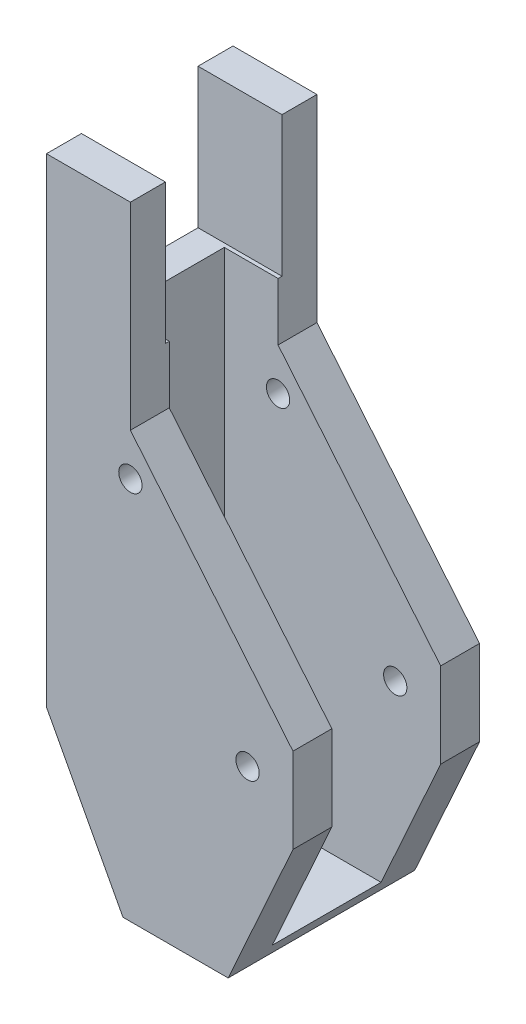
ISO-10303-21;
HEADER;
FILE_DESCRIPTION(('STEP AP214'),'2;1');
FILE_NAME('part.step','',(''),(''),'','','');
FILE_SCHEMA(('AUTOMOTIVE_DESIGN { 1 0 10303 214 1 1 1 1 }'));
ENDSEC;
DATA;
#1=APPLICATION_CONTEXT('core data for automotive mechanical design processes');
#2=APPLICATION_PROTOCOL_DEFINITION('international standard','automotive_design',2000,#1);
#3=PRODUCT_CONTEXT('',#1,'mechanical');
#4=PRODUCT('Part','Part','',(#3));
#5=PRODUCT_RELATED_PRODUCT_CATEGORY('part','',(#4));
#6=PRODUCT_DEFINITION_FORMATION('','',#4);
#7=PRODUCT_DEFINITION_CONTEXT('part definition',#1,'design');
#8=PRODUCT_DEFINITION('design','',#6,#7);
#9=PRODUCT_DEFINITION_SHAPE('','',#8);
#10=(LENGTH_UNIT() NAMED_UNIT(*) SI_UNIT(.MILLI.,.METRE.));
#11=(NAMED_UNIT(*) PLANE_ANGLE_UNIT() SI_UNIT($,.RADIAN.));
#12=(NAMED_UNIT(*) SI_UNIT($,.STERADIAN.) SOLID_ANGLE_UNIT());
#13=UNCERTAINTY_MEASURE_WITH_UNIT(LENGTH_MEASURE(1.E-05),#10,'distance_accuracy_value','');
#14=(GEOMETRIC_REPRESENTATION_CONTEXT(3) GLOBAL_UNCERTAINTY_ASSIGNED_CONTEXT((#13)) GLOBAL_UNIT_ASSIGNED_CONTEXT((#10,
#11,#12)) REPRESENTATION_CONTEXT('',''));
#15=CARTESIAN_POINT('',(0.,0.,0.));
#16=DIRECTION('',(0.,0.,1.));
#17=DIRECTION('',(1.,0.,0.));
#18=AXIS2_PLACEMENT_3D('',#15,#16,#17);
#19=CARTESIAN_POINT('',(0.,0.,19.));
#20=DIRECTION('',(0.,0.,-1.));
#21=DIRECTION('',(-1.,0.,0.));
#22=AXIS2_PLACEMENT_3D('',#19,#20,#21);
#23=PLANE('',#22);
#24=CARTESIAN_POINT('',(6.1762329932904,-28.7166750097972,19.));
#25=DIRECTION('',(0.,0.,1.));
#26=DIRECTION('',(0.,-1.,0.));
#27=AXIS2_PLACEMENT_3D('',#24,#25,#26);
#28=CIRCLE('',#27,1.5);
#29=CARTESIAN_POINT('',(6.1762329932904,-30.2166750097972,19.));
#30=VERTEX_POINT('',#29);
#31=EDGE_CURVE('E372',#30,#30,#28,.T.);
#32=ORIENTED_EDGE('',*,*,#31,.T.);
#33=EDGE_LOOP('',(#32));
#34=FACE_BOUND('',#33,.T.);
#35=CARTESIAN_POINT('',(-8.8962675718864,-4.21667500979055,19.));
#36=DIRECTION('',(0.,0.,1.));
#37=DIRECTION('',(0.,-1.,0.));
#38=AXIS2_PLACEMENT_3D('',#35,#36,#37);
#39=CIRCLE('',#38,1.5);
#40=CARTESIAN_POINT('',(-8.8962675718864,-5.71667500979055,19.));
#41=VERTEX_POINT('',#40);
#42=EDGE_CURVE('E376',#41,#41,#39,.T.);
#43=ORIENTED_EDGE('',*,*,#42,.T.);
#44=EDGE_LOOP('',(#43));
#45=FACE_BOUND('',#44,.T.);
#46=DIRECTION('',(1.,0.,0.));
#47=VECTOR('',#46,1.);
#48=CARTESIAN_POINT('',(-15.8155261006875,-52.0463170033039,19.));
#49=LINE('',#48,#47);
#50=CARTESIAN_POINT('',(-9.86507775354397,-52.0463170033039,19.));
#51=VERTEX_POINT('',#50);
#52=CARTESIAN_POINT('',(4.35754421369536,-52.0463170033039,19.));
#53=VERTEX_POINT('',#52);
#54=EDGE_CURVE('E198',#51,#53,#49,.T.);
#55=ORIENTED_EDGE('',*,*,#54,.F.);
#56=DIRECTION('',(0.8828123820911,0.469725768961675,0.));
#57=VECTOR('',#56,1.);
#58=CARTESIAN_POINT('',(19.4058989978255,-36.4718502856661,19.));
#59=LINE('',#58,#57);
#60=CARTESIAN_POINT('',(-8.71025996628948,-51.4318629198169,19.));
#61=VERTEX_POINT('',#60);
#62=EDGE_CURVE('E204',#51,#61,#59,.T.);
#63=ORIENTED_EDGE('',*,*,#62,.T.);
#64=DIRECTION('',(0.469725768961675,-0.882812382091101,0.));
#65=VECTOR('',#64,1.);
#66=CARTESIAN_POINT('',(-28.116158964115,-14.9600126341507,19.));
#67=LINE('',#66,#65);
#68=CARTESIAN_POINT('',(-12.650870925901,-44.0257967041209,19.));
#69=VERTEX_POINT('',#68);
#70=EDGE_CURVE('E190',#69,#61,#67,.T.);
#71=ORIENTED_EDGE('',*,*,#70,.F.);
#72=CARTESIAN_POINT('',(-16.1821204542654,-45.9046997799675,19.));
#73=DIRECTION('',(0.,0.,-1.));
#74=DIRECTION('',(-1.,0.,0.));
#75=AXIS2_PLACEMENT_3D('',#72,#73,#74);
#76=CIRCLE('',#75,4.);
#77=CARTESIAN_POINT('',(-15.8155261006875,-41.9215341319026,19.));
#78=VERTEX_POINT('',#77);
#79=EDGE_CURVE('E50',#69,#78,#76,.F.);
#80=ORIENTED_EDGE('',*,*,#79,.T.);
#81=DIRECTION('',(0.,1.,0.));
#82=VECTOR('',#81,1.);
#83=CARTESIAN_POINT('',(-15.8155261006875,26.6129669837228,19.));
#84=LINE('',#83,#82);
#85=CARTESIAN_POINT('',(-15.8155261006875,8.61296698372278,19.));
#86=VERTEX_POINT('',#85);
#87=EDGE_CURVE('E355',#78,#86,#84,.T.);
#88=ORIENTED_EDGE('',*,*,#87,.T.);
#89=DIRECTION('',(-1.,0.,0.));
#90=VECTOR('',#89,1.);
#91=CARTESIAN_POINT('',(0.,8.61296698372278,19.));
#92=LINE('',#91,#90);
#93=CARTESIAN_POINT('',(-8.8962675718864,8.61296698372278,19.));
#94=VERTEX_POINT('',#93);
#95=EDGE_CURVE('E280',#94,#86,#92,.T.);
#96=ORIENTED_EDGE('',*,*,#95,.F.);
#97=DIRECTION('',(0.,1.,0.));
#98=VECTOR('',#97,1.);
#99=CARTESIAN_POINT('',(-8.8962675718864,0.,19.));
#100=LINE('',#99,#98);
#101=CARTESIAN_POINT('',(-8.8962675718864,1.19737919058593,19.));
#102=VERTEX_POINT('',#101);
#103=EDGE_CURVE('E324',#102,#94,#100,.T.);
#104=ORIENTED_EDGE('',*,*,#103,.F.);
#105=DIRECTION('',(-0.637310569161828,0.770607058386196,0.));
#106=VECTOR('',#105,1.);
#107=CARTESIAN_POINT('',(-4.69486506864955,-3.88276631582515,19.));
#108=LINE('',#107,#106);
#109=CARTESIAN_POINT('',(12.0229909568544,-24.0972401967161,19.));
#110=VERTEX_POINT('',#109);
#111=EDGE_CURVE('E338',#110,#102,#108,.T.);
#112=ORIENTED_EDGE('',*,*,#111,.F.);
#113=DIRECTION('',(0.,1.,0.));
#114=VECTOR('',#113,1.);
#115=CARTESIAN_POINT('',(12.0229909568544,0.,19.));
#116=LINE('',#115,#114);
#117=CARTESIAN_POINT('',(12.0229909568544,-35.0463170033039,19.));
#118=VERTEX_POINT('',#117);
#119=EDGE_CURVE('E381',#118,#110,#116,.T.);
#120=ORIENTED_EDGE('',*,*,#119,.F.);
#121=DIRECTION('',(-0.411053391132709,-0.911611271122895,0.));
#122=VECTOR('',#121,1.);
#123=CARTESIAN_POINT('',(3.68356302452966,-53.541034871645,19.));
#124=LINE('',#123,#122);
#125=EDGE_CURVE('E229',#118,#53,#124,.T.);
#126=ORIENTED_EDGE('',*,*,#125,.T.);
#127=EDGE_LOOP('',(#55,#63,#71,#80,#88,#96,#104,#112,#120,#126));
#128=FACE_BOUND('',#127,.T.);
#129=ADVANCED_FACE('F41',(#34,#45,#128),#23,.T.);
#130=CARTESIAN_POINT('',(0.,0.,5.));
#131=DIRECTION('',(0.,0.,-1.));
#132=DIRECTION('',(-1.,0.,0.));
#133=AXIS2_PLACEMENT_3D('',#130,#131,#132);
#134=PLANE('',#133);
#135=CARTESIAN_POINT('',(-8.8962675718864,-4.21667500979055,5.));
#136=DIRECTION('',(0.,0.,-1.));
#137=DIRECTION('',(-1.,0.,0.));
#138=AXIS2_PLACEMENT_3D('',#135,#136,#137);
#139=CIRCLE('',#138,1.5);
#140=CARTESIAN_POINT('',(-10.3962675718864,-4.21667500979055,5.));
#141=VERTEX_POINT('',#140);
#142=EDGE_CURVE('E368',#141,#141,#139,.T.);
#143=ORIENTED_EDGE('',*,*,#142,.T.);
#144=EDGE_LOOP('',(#143));
#145=FACE_BOUND('',#144,.T.);
#146=CARTESIAN_POINT('',(6.1762329932904,-28.7166750097972,5.));
#147=DIRECTION('',(0.,0.,-1.));
#148=DIRECTION('',(-1.,0.,0.));
#149=AXIS2_PLACEMENT_3D('',#146,#147,#148);
#150=CIRCLE('',#149,1.5);
#151=CARTESIAN_POINT('',(4.6762329932904,-28.7166750097972,5.));
#152=VERTEX_POINT('',#151);
#153=EDGE_CURVE('E364',#152,#152,#150,.T.);
#154=ORIENTED_EDGE('',*,*,#153,.T.);
#155=EDGE_LOOP('',(#154));
#156=FACE_BOUND('',#155,.T.);
#157=DIRECTION('',(0.8828123820911,0.469725768961675,0.));
#158=VECTOR('',#157,1.);
#159=CARTESIAN_POINT('',(19.4058989978255,-36.4718502856661,5.));
#160=LINE('',#159,#158);
#161=CARTESIAN_POINT('',(-9.86507775354397,-52.0463170033039,5.));
#162=VERTEX_POINT('',#161);
#163=CARTESIAN_POINT('',(-8.71025996628948,-51.4318629198169,5.));
#164=VERTEX_POINT('',#163);
#165=EDGE_CURVE('E207',#162,#164,#160,.T.);
#166=ORIENTED_EDGE('',*,*,#165,.F.);
#167=DIRECTION('',(-1.,0.,0.));
#168=VECTOR('',#167,1.);
#169=CARTESIAN_POINT('',(-15.8155261006875,-52.0463170033039,5.));
#170=LINE('',#169,#168);
#171=CARTESIAN_POINT('',(4.35754421369537,-52.0463170033039,5.));
#172=VERTEX_POINT('',#171);
#173=EDGE_CURVE('E221',#172,#162,#170,.T.);
#174=ORIENTED_EDGE('',*,*,#173,.F.);
#175=DIRECTION('',(0.411053391132709,0.911611271122895,0.));
#176=VECTOR('',#175,1.);
#177=CARTESIAN_POINT('',(3.68356302452966,-53.541034871645,5.));
#178=LINE('',#177,#176);
#179=CARTESIAN_POINT('',(12.0229909568544,-35.0463170033039,5.));
#180=VERTEX_POINT('',#179);
#181=EDGE_CURVE('E232',#172,#180,#178,.T.);
#182=ORIENTED_EDGE('',*,*,#181,.T.);
#183=DIRECTION('',(0.,1.,0.));
#184=VECTOR('',#183,1.);
#185=CARTESIAN_POINT('',(12.0229909568544,0.,5.));
#186=LINE('',#185,#184);
#187=CARTESIAN_POINT('',(12.0229909568544,-24.0972401967161,5.));
#188=VERTEX_POINT('',#187);
#189=EDGE_CURVE('E380',#180,#188,#186,.T.);
#190=ORIENTED_EDGE('',*,*,#189,.T.);
#191=DIRECTION('',(-0.637310569161828,0.770607058386196,0.));
#192=VECTOR('',#191,1.);
#193=CARTESIAN_POINT('',(-4.69486506864955,-3.88276631582515,5.));
#194=LINE('',#193,#192);
#195=CARTESIAN_POINT('',(-8.8962675718864,1.19737919058593,5.));
#196=VERTEX_POINT('',#195);
#197=EDGE_CURVE('E428',#188,#196,#194,.T.);
#198=ORIENTED_EDGE('',*,*,#197,.T.);
#199=DIRECTION('',(0.,1.,0.));
#200=VECTOR('',#199,1.);
#201=CARTESIAN_POINT('',(-8.8962675718864,0.,5.));
#202=LINE('',#201,#200);
#203=CARTESIAN_POINT('',(-8.8962675718864,8.61296698372278,5.));
#204=VERTEX_POINT('',#203);
#205=EDGE_CURVE('E424',#196,#204,#202,.T.);
#206=ORIENTED_EDGE('',*,*,#205,.T.);
#207=DIRECTION('',(-1.,0.,0.));
#208=VECTOR('',#207,1.);
#209=CARTESIAN_POINT('',(0.,8.61296698372278,5.));
#210=LINE('',#209,#208);
#211=CARTESIAN_POINT('',(-15.8155261006875,8.61296698372278,5.));
#212=VERTEX_POINT('',#211);
#213=EDGE_CURVE('E296',#204,#212,#210,.T.);
#214=ORIENTED_EDGE('',*,*,#213,.T.);
#215=DIRECTION('',(0.,-1.,0.));
#216=VECTOR('',#215,1.);
#217=CARTESIAN_POINT('',(-15.8155261006875,26.6129669837228,5.));
#218=LINE('',#217,#216);
#219=CARTESIAN_POINT('',(-15.8155261006875,-41.9215341319026,5.));
#220=VERTEX_POINT('',#219);
#221=EDGE_CURVE('E361',#212,#220,#218,.T.);
#222=ORIENTED_EDGE('',*,*,#221,.T.);
#223=CARTESIAN_POINT('',(-16.1821204542654,-45.9046997799675,5.));
#224=DIRECTION('',(0.,0.,-1.));
#225=DIRECTION('',(-1.,0.,0.));
#226=AXIS2_PLACEMENT_3D('',#223,#224,#225);
#227=CIRCLE('',#226,4.);
#228=CARTESIAN_POINT('',(-12.650870925901,-44.0257967041209,5.));
#229=VERTEX_POINT('',#228);
#230=EDGE_CURVE('E11',#220,#229,#227,.T.);
#231=ORIENTED_EDGE('',*,*,#230,.T.);
#232=DIRECTION('',(0.469725768961675,-0.882812382091101,0.));
#233=VECTOR('',#232,1.);
#234=CARTESIAN_POINT('',(-28.116158964115,-14.9600126341507,5.));
#235=LINE('',#234,#233);
#236=EDGE_CURVE('E447',#229,#164,#235,.T.);
#237=ORIENTED_EDGE('',*,*,#236,.T.);
#238=EDGE_LOOP('',(#166,#174,#182,#190,#198,#206,#214,#222,#231,#237));
#239=FACE_BOUND('',#238,.T.);
#240=ADVANCED_FACE('F464',(#145,#156,#239),#134,.F.);
#241=CARTESIAN_POINT('',(-15.8155261006875,0.,0.));
#242=DIRECTION('',(1.,0.,0.));
#243=DIRECTION('',(0.,0.,-1.));
#244=AXIS2_PLACEMENT_3D('',#241,#242,#243);
#245=PLANE('',#244);
#246=ORIENTED_EDGE('',*,*,#87,.F.);
#247=DIRECTION('',(0.,0.,-1.));
#248=VECTOR('',#247,1.);
#249=CARTESIAN_POINT('',(-15.8155261006875,-41.9215341319026,0.));
#250=LINE('',#249,#248);
#251=EDGE_CURVE('E199',#78,#220,#250,.T.);
#252=ORIENTED_EDGE('',*,*,#251,.T.);
#253=ORIENTED_EDGE('',*,*,#221,.F.);
#254=DIRECTION('',(0.,0.,-1.));
#255=VECTOR('',#254,1.);
#256=CARTESIAN_POINT('',(-15.8155261006875,8.61296698372278,0.));
#257=LINE('',#256,#255);
#258=EDGE_CURVE('E293',#86,#212,#257,.T.);
#259=ORIENTED_EDGE('',*,*,#258,.F.);
#260=EDGE_LOOP('',(#246,#252,#253,#259));
#261=FACE_BOUND('',#260,.T.);
#262=ADVANCED_FACE('F456',(#261),#245,.T.);
#263=CARTESIAN_POINT('',(0.,-52.0463170033039,0.));
#264=DIRECTION('',(0.,1.,0.));
#265=DIRECTION('',(0.,0.,1.));
#266=AXIS2_PLACEMENT_3D('',#263,#264,#265);
#267=PLANE('',#266);
#268=ORIENTED_EDGE('',*,*,#173,.T.);
#269=DIRECTION('',(0.,0.,1.));
#270=VECTOR('',#269,1.);
#271=CARTESIAN_POINT('',(-9.86507775354397,-52.0463170033039,0.));
#272=LINE('',#271,#270);
#273=EDGE_CURVE('E444',#162,#51,#272,.T.);
#274=ORIENTED_EDGE('',*,*,#273,.T.);
#275=ORIENTED_EDGE('',*,*,#54,.T.);
#276=DIRECTION('',(0.,0.,1.));
#277=VECTOR('',#276,1.);
#278=CARTESIAN_POINT('',(4.35754421369536,-52.0463170033039,0.));
#279=LINE('',#278,#277);
#280=EDGE_CURVE('E225',#172,#53,#279,.T.);
#281=ORIENTED_EDGE('',*,*,#280,.F.);
#282=EDGE_LOOP('',(#268,#274,#275,#281));
#283=FACE_BOUND('',#282,.T.);
#284=ADVANCED_FACE('F512',(#283),#267,.T.);
#285=CARTESIAN_POINT('',(-29.8155261006875,26.6129669837228,24.));
#286=DIRECTION('',(0.,-1.,0.));
#287=DIRECTION('',(0.,0.,-1.));
#288=AXIS2_PLACEMENT_3D('',#285,#286,#287);
#289=PLANE('',#288);
#290=DIRECTION('',(0.,0.,1.));
#291=VECTOR('',#290,1.);
#292=CARTESIAN_POINT('',(-19.6941489014701,26.6129669837228,0.));
#293=LINE('',#292,#291);
#294=CARTESIAN_POINT('',(-19.6941489014701,26.6129669837228,0.));
#295=VERTEX_POINT('',#294);
#296=CARTESIAN_POINT('',(-19.6941489014701,26.6129669837228,4.5));
#297=VERTEX_POINT('',#296);
#298=EDGE_CURVE('E351',#295,#297,#293,.T.);
#299=ORIENTED_EDGE('',*,*,#298,.T.);
#300=DIRECTION('',(-1.,0.,0.));
#301=VECTOR('',#300,1.);
#302=CARTESIAN_POINT('',(12.0229909568544,26.6129669837228,4.5));
#303=LINE('',#302,#301);
#304=CARTESIAN_POINT('',(-8.8962675718864,26.6129669837228,4.5));
#305=VERTEX_POINT('',#304);
#306=EDGE_CURVE('E277',#305,#297,#303,.T.);
#307=ORIENTED_EDGE('',*,*,#306,.F.);
#308=DIRECTION('',(0.,0.,1.));
#309=VECTOR('',#308,1.);
#310=CARTESIAN_POINT('',(-8.8962675718864,26.6129669837213,0.));
#311=LINE('',#310,#309);
#312=CARTESIAN_POINT('',(-8.8962675718864,26.6129669837213,0.));
#313=VERTEX_POINT('',#312);
#314=EDGE_CURVE('E331',#313,#305,#311,.T.);
#315=ORIENTED_EDGE('',*,*,#314,.F.);
#316=DIRECTION('',(-1.,0.,0.));
#317=VECTOR('',#316,1.);
#318=CARTESIAN_POINT('',(-29.8155261006875,26.6129669837228,0.));
#319=LINE('',#318,#317);
#320=EDGE_CURVE('E410',#313,#295,#319,.T.);
#321=ORIENTED_EDGE('',*,*,#320,.T.);
#322=EDGE_LOOP('',(#299,#307,#315,#321));
#323=FACE_BOUND('',#322,.T.);
#324=ADVANCED_FACE('F499',(#323),#289,.F.);
#325=CARTESIAN_POINT('',(12.0229909568544,-35.0463170033039,24.));
#326=DIRECTION('',(-1.,0.,0.));
#327=DIRECTION('',(0.,0.,1.));
#328=AXIS2_PLACEMENT_3D('',#325,#326,#327);
#329=PLANE('',#328);
#330=ORIENTED_EDGE('',*,*,#119,.T.);
#331=DIRECTION('',(0.,0.,1.));
#332=VECTOR('',#331,1.);
#333=CARTESIAN_POINT('',(12.0229909568544,-24.0972401967161,0.));
#334=LINE('',#333,#332);
#335=CARTESIAN_POINT('',(12.0229909568544,-24.0972401967161,24.));
#336=VERTEX_POINT('',#335);
#337=EDGE_CURVE('E325',#110,#336,#334,.T.);
#338=ORIENTED_EDGE('',*,*,#337,.T.);
#339=DIRECTION('',(0.,1.,0.));
#340=VECTOR('',#339,1.);
#341=CARTESIAN_POINT('',(12.0229909568544,-35.0463170033039,24.));
#342=LINE('',#341,#340);
#343=CARTESIAN_POINT('',(12.0229909568544,-35.0463170033039,24.));
#344=VERTEX_POINT('',#343);
#345=EDGE_CURVE('E405',#344,#336,#342,.T.);
#346=ORIENTED_EDGE('',*,*,#345,.F.);
#347=DIRECTION('',(0.,0.,-1.));
#348=VECTOR('',#347,1.);
#349=CARTESIAN_POINT('',(12.0229909568544,-35.0463170033039,24.));
#350=LINE('',#349,#348);
#351=EDGE_CURVE('E420',#344,#118,#350,.T.);
#352=ORIENTED_EDGE('',*,*,#351,.T.);
#353=EDGE_LOOP('',(#330,#338,#346,#352));
#354=FACE_BOUND('',#353,.T.);
#355=ADVANCED_FACE('F502',(#354),#329,.F.);
#356=CARTESIAN_POINT('',(-8.8962675718864,-4.21667500979055,24.));
#357=DIRECTION('',(0.,0.,-1.));
#358=DIRECTION('',(-1.,0.,0.));
#359=AXIS2_PLACEMENT_3D('',#356,#357,#358);
#360=CYLINDRICAL_SURFACE('',#359,1.5);
#361=ORIENTED_EDGE('',*,*,#42,.F.);
#362=EDGE_LOOP('',(#361));
#363=FACE_BOUND('',#362,.T.);
#364=CARTESIAN_POINT('',(-8.8962675718864,-4.21667500979055,24.));
#365=DIRECTION('',(0.,0.,1.));
#366=DIRECTION('',(1.,0.,0.));
#367=AXIS2_PLACEMENT_3D('',#364,#365,#366);
#368=CIRCLE('',#367,1.5);
#369=CARTESIAN_POINT('',(-7.3962675718864,-4.21667500979055,24.));
#370=VERTEX_POINT('',#369);
#371=EDGE_CURVE('E397',#370,#370,#368,.T.);
#372=ORIENTED_EDGE('',*,*,#371,.T.);
#373=EDGE_LOOP('',(#372));
#374=FACE_BOUND('',#373,.T.);
#375=ADVANCED_FACE('F487',(#363,#374),#360,.F.);
#376=CARTESIAN_POINT('',(6.1762329932904,-28.7166750097972,24.));
#377=DIRECTION('',(0.,0.,-1.));
#378=DIRECTION('',(-1.,0.,0.));
#379=AXIS2_PLACEMENT_3D('',#376,#377,#378);
#380=CYLINDRICAL_SURFACE('',#379,1.5);
#381=ORIENTED_EDGE('',*,*,#31,.F.);
#382=EDGE_LOOP('',(#381));
#383=FACE_BOUND('',#382,.T.);
#384=CARTESIAN_POINT('',(6.1762329932904,-28.7166750097972,24.));
#385=DIRECTION('',(0.,0.,1.));
#386=DIRECTION('',(1.,0.,0.));
#387=AXIS2_PLACEMENT_3D('',#384,#385,#386);
#388=CIRCLE('',#387,1.5);
#389=CARTESIAN_POINT('',(7.6762329932904,-28.7166750097972,24.));
#390=VERTEX_POINT('',#389);
#391=EDGE_CURVE('E389',#390,#390,#388,.T.);
#392=ORIENTED_EDGE('',*,*,#391,.T.);
#393=EDGE_LOOP('',(#392));
#394=FACE_BOUND('',#393,.T.);
#395=ADVANCED_FACE('F482',(#383,#394),#380,.F.);
#396=CARTESIAN_POINT('',(-8.8962675718864,26.6129669837228,19.5));
#397=VERTEX_POINT('',#396);
#398=CARTESIAN_POINT('',(-8.8962675718864,26.6129669837213,24.));
#399=VERTEX_POINT('',#398);
#400=EDGE_CURVE('E314',#397,#399,#311,.T.);
#401=ORIENTED_EDGE('',*,*,#400,.F.);
#402=DIRECTION('',(-1.,0.,0.));
#403=VECTOR('',#402,1.);
#404=CARTESIAN_POINT('',(12.0229909568544,26.6129669837228,19.5));
#405=LINE('',#404,#403);
#406=CARTESIAN_POINT('',(-19.6941489014701,26.6129669837228,19.5));
#407=VERTEX_POINT('',#406);
#408=EDGE_CURVE('E281',#397,#407,#405,.T.);
#409=ORIENTED_EDGE('',*,*,#408,.T.);
#410=CARTESIAN_POINT('',(-19.6941489014701,26.6129669837228,24.));
#411=VERTEX_POINT('',#410);
#412=EDGE_CURVE('E356',#407,#411,#293,.T.);
#413=ORIENTED_EDGE('',*,*,#412,.T.);
#414=DIRECTION('',(-1.,0.,0.));
#415=VECTOR('',#414,1.);
#416=CARTESIAN_POINT('',(-29.8155261006875,26.6129669837228,24.));
#417=LINE('',#416,#415);
#418=EDGE_CURVE('E409',#399,#411,#417,.T.);
#419=ORIENTED_EDGE('',*,*,#418,.F.);
#420=EDGE_LOOP('',(#401,#409,#413,#419));
#421=FACE_BOUND('',#420,.T.);
#422=ADVANCED_FACE('F492',(#421),#289,.F.);
#423=CARTESIAN_POINT('',(0.,0.,24.));
#424=DIRECTION('',(0.,0.,-1.));
#425=DIRECTION('',(-1.,0.,0.));
#426=AXIS2_PLACEMENT_3D('',#423,#424,#425);
#427=PLANE('',#426);
#428=ORIENTED_EDGE('',*,*,#345,.T.);
#429=DIRECTION('',(0.637310569161828,-0.770607058386196,0.));
#430=VECTOR('',#429,1.);
#431=CARTESIAN_POINT('',(-8.8962675718864,1.19737919058593,24.));
#432=LINE('',#431,#430);
#433=CARTESIAN_POINT('',(-8.8962675718864,1.19737919058593,24.));
#434=VERTEX_POINT('',#433);
#435=EDGE_CURVE('E310',#434,#336,#432,.T.);
#436=ORIENTED_EDGE('',*,*,#435,.F.);
#437=DIRECTION('',(0.,-1.,0.));
#438=VECTOR('',#437,1.);
#439=CARTESIAN_POINT('',(-8.8962675718864,26.6129669837213,24.));
#440=LINE('',#439,#438);
#441=EDGE_CURVE('E304',#399,#434,#440,.T.);
#442=ORIENTED_EDGE('',*,*,#441,.F.);
#443=ORIENTED_EDGE('',*,*,#418,.T.);
#444=DIRECTION('',(0.,1.,0.));
#445=VECTOR('',#444,1.);
#446=CARTESIAN_POINT('',(-19.6941489014701,26.6129669837228,24.));
#447=LINE('',#446,#445);
#448=CARTESIAN_POINT('',(-19.6941489014701,-35.0463170033039,24.));
#449=VERTEX_POINT('',#448);
#450=EDGE_CURVE('E342',#449,#411,#447,.T.);
#451=ORIENTED_EDGE('',*,*,#450,.F.);
#452=DIRECTION('',(0.469725768961675,-0.8828123820911,0.));
#453=VECTOR('',#452,1.);
#454=CARTESIAN_POINT('',(-19.6941489014701,-35.0463170033039,24.));
#455=LINE('',#454,#453);
#456=CARTESIAN_POINT('',(-9.85350127500847,-53.541034871645,24.));
#457=VERTEX_POINT('',#456);
#458=EDGE_CURVE('E235',#449,#457,#455,.T.);
#459=ORIENTED_EDGE('',*,*,#458,.T.);
#460=DIRECTION('',(1.,0.,0.));
#461=VECTOR('',#460,1.);
#462=CARTESIAN_POINT('',(-9.85350127500847,-53.541034871645,24.));
#463=LINE('',#462,#461);
#464=CARTESIAN_POINT('',(3.68356302452966,-53.541034871645,24.));
#465=VERTEX_POINT('',#464);
#466=EDGE_CURVE('E253',#457,#465,#463,.T.);
#467=ORIENTED_EDGE('',*,*,#466,.T.);
#468=DIRECTION('',(0.411053391132709,0.911611271122895,0.));
#469=VECTOR('',#468,1.);
#470=CARTESIAN_POINT('',(3.68356302452966,-53.541034871645,24.));
#471=LINE('',#470,#469);
#472=EDGE_CURVE('E241',#465,#344,#471,.T.);
#473=ORIENTED_EDGE('',*,*,#472,.T.);
#474=EDGE_LOOP('',(#428,#436,#442,#443,#451,#459,#467,#473));
#475=FACE_BOUND('',#474,.T.);
#476=ORIENTED_EDGE('',*,*,#371,.F.);
#477=EDGE_LOOP('',(#476));
#478=FACE_BOUND('',#477,.T.);
#479=ORIENTED_EDGE('',*,*,#391,.F.);
#480=EDGE_LOOP('',(#479));
#481=FACE_BOUND('',#480,.T.);
#482=ADVANCED_FACE('F488',(#475,#478,#481),#427,.F.);
#483=CARTESIAN_POINT('',(0.,0.,0.));
#484=DIRECTION('',(0.,0.,-1.));
#485=DIRECTION('',(-1.,0.,0.));
#486=AXIS2_PLACEMENT_3D('',#483,#484,#485);
#487=PLANE('',#486);
#488=DIRECTION('',(0.637310569161828,-0.770607058386196,0.));
#489=VECTOR('',#488,1.);
#490=CARTESIAN_POINT('',(-8.8962675718864,1.19737919058593,0.));
#491=LINE('',#490,#489);
#492=CARTESIAN_POINT('',(-8.8962675718864,1.19737919058593,0.));
#493=VERTEX_POINT('',#492);
#494=CARTESIAN_POINT('',(12.0229909568544,-24.0972401967161,0.));
#495=VERTEX_POINT('',#494);
#496=EDGE_CURVE('E309',#493,#495,#491,.T.);
#497=ORIENTED_EDGE('',*,*,#496,.T.);
#498=DIRECTION('',(0.,1.,0.));
#499=VECTOR('',#498,1.);
#500=CARTESIAN_POINT('',(12.0229909568544,-35.0463170033039,0.));
#501=LINE('',#500,#499);
#502=CARTESIAN_POINT('',(12.0229909568544,-35.0463170033039,0.));
#503=VERTEX_POINT('',#502);
#504=EDGE_CURVE('E401',#503,#495,#501,.T.);
#505=ORIENTED_EDGE('',*,*,#504,.F.);
#506=DIRECTION('',(0.411053391132709,0.911611271122895,0.));
#507=VECTOR('',#506,1.);
#508=CARTESIAN_POINT('',(3.68356302452966,-53.541034871645,0.));
#509=LINE('',#508,#507);
#510=CARTESIAN_POINT('',(3.68356302452966,-53.541034871645,0.));
#511=VERTEX_POINT('',#510);
#512=EDGE_CURVE('E245',#511,#503,#509,.T.);
#513=ORIENTED_EDGE('',*,*,#512,.F.);
#514=DIRECTION('',(1.,0.,0.));
#515=VECTOR('',#514,1.);
#516=CARTESIAN_POINT('',(-9.85350127500847,-53.541034871645,0.));
#517=LINE('',#516,#515);
#518=CARTESIAN_POINT('',(-9.85350127500847,-53.541034871645,0.));
#519=VERTEX_POINT('',#518);
#520=EDGE_CURVE('E240',#519,#511,#517,.T.);
#521=ORIENTED_EDGE('',*,*,#520,.F.);
#522=DIRECTION('',(0.469725768961675,-0.8828123820911,0.));
#523=VECTOR('',#522,1.);
#524=CARTESIAN_POINT('',(-19.6941489014701,-35.0463170033039,0.));
#525=LINE('',#524,#523);
#526=CARTESIAN_POINT('',(-19.6941489014701,-35.0463170033039,0.));
#527=VERTEX_POINT('',#526);
#528=EDGE_CURVE('E236',#527,#519,#525,.T.);
#529=ORIENTED_EDGE('',*,*,#528,.F.);
#530=DIRECTION('',(0.,1.,0.));
#531=VECTOR('',#530,1.);
#532=CARTESIAN_POINT('',(-19.6941489014701,26.6129669837228,0.));
#533=LINE('',#532,#531);
#534=EDGE_CURVE('E343',#527,#295,#533,.T.);
#535=ORIENTED_EDGE('',*,*,#534,.T.);
#536=ORIENTED_EDGE('',*,*,#320,.F.);
#537=DIRECTION('',(0.,-1.,0.));
#538=VECTOR('',#537,1.);
#539=CARTESIAN_POINT('',(-8.8962675718864,26.6129669837213,0.));
#540=LINE('',#539,#538);
#541=EDGE_CURVE('E305',#313,#493,#540,.T.);
#542=ORIENTED_EDGE('',*,*,#541,.T.);
#543=EDGE_LOOP('',(#497,#505,#513,#521,#529,#535,#536,#542));
#544=FACE_BOUND('',#543,.T.);
#545=CARTESIAN_POINT('',(-8.8962675718864,-4.21667500979055,0.));
#546=DIRECTION('',(0.,0.,1.));
#547=DIRECTION('',(1.,0.,0.));
#548=AXIS2_PLACEMENT_3D('',#545,#546,#547);
#549=CIRCLE('',#548,1.5);
#550=CARTESIAN_POINT('',(-7.3962675718864,-4.21667500979055,0.));
#551=VERTEX_POINT('',#550);
#552=EDGE_CURVE('E393',#551,#551,#549,.T.);
#553=ORIENTED_EDGE('',*,*,#552,.T.);
#554=EDGE_LOOP('',(#553));
#555=FACE_BOUND('',#554,.T.);
#556=CARTESIAN_POINT('',(6.1762329932904,-28.7166750097972,0.));
#557=DIRECTION('',(0.,0.,1.));
#558=DIRECTION('',(1.,0.,0.));
#559=AXIS2_PLACEMENT_3D('',#556,#557,#558);
#560=CIRCLE('',#559,1.5);
#561=CARTESIAN_POINT('',(7.6762329932904,-28.7166750097972,0.));
#562=VERTEX_POINT('',#561);
#563=EDGE_CURVE('E385',#562,#562,#560,.T.);
#564=ORIENTED_EDGE('',*,*,#563,.T.);
#565=EDGE_LOOP('',(#564));
#566=FACE_BOUND('',#565,.T.);
#567=ADVANCED_FACE('F491',(#544,#555,#566),#487,.T.);
#568=ORIENTED_EDGE('',*,*,#504,.T.);
#569=EDGE_CURVE('E320',#495,#188,#334,.T.);
#570=ORIENTED_EDGE('',*,*,#569,.T.);
#571=ORIENTED_EDGE('',*,*,#189,.F.);
#572=EDGE_CURVE('E414',#180,#503,#350,.T.);
#573=ORIENTED_EDGE('',*,*,#572,.T.);
#574=EDGE_LOOP('',(#568,#570,#571,#573));
#575=FACE_BOUND('',#574,.T.);
#576=ADVANCED_FACE('F485',(#575),#329,.F.);
#577=ORIENTED_EDGE('',*,*,#142,.F.);
#578=EDGE_LOOP('',(#577));
#579=FACE_BOUND('',#578,.T.);
#580=ORIENTED_EDGE('',*,*,#552,.F.);
#581=EDGE_LOOP('',(#580));
#582=FACE_BOUND('',#581,.T.);
#583=ADVANCED_FACE('F480',(#579,#582),#360,.F.);
#584=ORIENTED_EDGE('',*,*,#153,.F.);
#585=EDGE_LOOP('',(#584));
#586=FACE_BOUND('',#585,.T.);
#587=ORIENTED_EDGE('',*,*,#563,.F.);
#588=EDGE_LOOP('',(#587));
#589=FACE_BOUND('',#588,.T.);
#590=ADVANCED_FACE('F476',(#586,#589),#380,.F.);
#591=CARTESIAN_POINT('',(-19.6941489014701,26.6129669837228,0.));
#592=DIRECTION('',(1.,0.,0.));
#593=DIRECTION('',(0.,0.,-1.));
#594=AXIS2_PLACEMENT_3D('',#591,#592,#593);
#595=PLANE('',#594);
#596=DIRECTION('',(0.,0.,1.));
#597=VECTOR('',#596,1.);
#598=CARTESIAN_POINT('',(-19.6941489014701,8.61296698372278,4.5));
#599=LINE('',#598,#597);
#600=CARTESIAN_POINT('',(-19.6941489014701,8.61296698372278,4.5));
#601=VERTEX_POINT('',#600);
#602=CARTESIAN_POINT('',(-19.6941489014701,8.61296698372278,19.5));
#603=VERTEX_POINT('',#602);
#604=EDGE_CURVE('E269',#601,#603,#599,.T.);
#605=ORIENTED_EDGE('',*,*,#604,.F.);
#606=DIRECTION('',(0.,-1.,0.));
#607=VECTOR('',#606,1.);
#608=CARTESIAN_POINT('',(-19.6941489014701,26.6129669837228,4.5));
#609=LINE('',#608,#607);
#610=EDGE_CURVE('E263',#297,#601,#609,.T.);
#611=ORIENTED_EDGE('',*,*,#610,.F.);
#612=ORIENTED_EDGE('',*,*,#298,.F.);
#613=ORIENTED_EDGE('',*,*,#534,.F.);
#614=DIRECTION('',(0.,0.,1.));
#615=VECTOR('',#614,1.);
#616=CARTESIAN_POINT('',(-19.6941489014701,-35.0463170033039,0.));
#617=LINE('',#616,#615);
#618=EDGE_CURVE('E347',#527,#449,#617,.T.);
#619=ORIENTED_EDGE('',*,*,#618,.T.);
#620=ORIENTED_EDGE('',*,*,#450,.T.);
#621=ORIENTED_EDGE('',*,*,#412,.F.);
#622=DIRECTION('',(0.,1.,0.));
#623=VECTOR('',#622,1.);
#624=CARTESIAN_POINT('',(-19.6941489014701,26.6129669837228,19.5));
#625=LINE('',#624,#623);
#626=EDGE_CURVE('E273',#603,#407,#625,.T.);
#627=ORIENTED_EDGE('',*,*,#626,.F.);
#628=EDGE_LOOP('',(#605,#611,#612,#613,#619,#620,#621,#627));
#629=FACE_BOUND('',#628,.T.);
#630=ADVANCED_FACE('F479',(#629),#595,.F.);
#631=CARTESIAN_POINT('',(-8.8962675718864,26.6129669837213,0.));
#632=DIRECTION('',(-1.,0.,0.));
#633=DIRECTION('',(0.,0.,1.));
#634=AXIS2_PLACEMENT_3D('',#631,#632,#633);
#635=PLANE('',#634);
#636=ORIENTED_EDGE('',*,*,#314,.T.);
#637=DIRECTION('',(0.,-1.,0.));
#638=VECTOR('',#637,1.);
#639=CARTESIAN_POINT('',(-8.8962675718864,26.6129669837213,4.5));
#640=LINE('',#639,#638);
#641=CARTESIAN_POINT('',(-8.8962675718864,8.61296698372278,4.5));
#642=VERTEX_POINT('',#641);
#643=EDGE_CURVE('E440',#305,#642,#640,.T.);
#644=ORIENTED_EDGE('',*,*,#643,.T.);
#645=DIRECTION('',(0.,0.,1.));
#646=VECTOR('',#645,1.);
#647=CARTESIAN_POINT('',(-8.8962675718864,8.61296698372278,0.));
#648=LINE('',#647,#646);
#649=EDGE_CURVE('E300',#642,#204,#648,.T.);
#650=ORIENTED_EDGE('',*,*,#649,.T.);
#651=ORIENTED_EDGE('',*,*,#205,.F.);
#652=DIRECTION('',(0.,0.,1.));
#653=VECTOR('',#652,1.);
#654=CARTESIAN_POINT('',(-8.8962675718864,1.19737919058593,0.));
#655=LINE('',#654,#653);
#656=EDGE_CURVE('E326',#493,#196,#655,.T.);
#657=ORIENTED_EDGE('',*,*,#656,.F.);
#658=ORIENTED_EDGE('',*,*,#541,.F.);
#659=EDGE_LOOP('',(#636,#644,#650,#651,#657,#658));
#660=FACE_BOUND('',#659,.T.);
#661=ADVANCED_FACE('F564',(#660),#635,.F.);
#662=CARTESIAN_POINT('',(-8.8962675718864,1.19737919058593,0.));
#663=DIRECTION('',(-0.770607058386196,-0.637310569161828,0.));
#664=DIRECTION('',(0.637310569161828,-0.770607058386196,0.));
#665=AXIS2_PLACEMENT_3D('',#662,#663,#664);
#666=PLANE('',#665);
#667=ORIENTED_EDGE('',*,*,#569,.F.);
#668=ORIENTED_EDGE('',*,*,#496,.F.);
#669=ORIENTED_EDGE('',*,*,#656,.T.);
#670=ORIENTED_EDGE('',*,*,#197,.F.);
#671=EDGE_LOOP('',(#667,#668,#669,#670));
#672=FACE_BOUND('',#671,.T.);
#673=ADVANCED_FACE('F562',(#672),#666,.F.);
#674=ORIENTED_EDGE('',*,*,#111,.T.);
#675=EDGE_CURVE('E330',#102,#434,#655,.T.);
#676=ORIENTED_EDGE('',*,*,#675,.T.);
#677=ORIENTED_EDGE('',*,*,#435,.T.);
#678=ORIENTED_EDGE('',*,*,#337,.F.);
#679=EDGE_LOOP('',(#674,#676,#677,#678));
#680=FACE_BOUND('',#679,.T.);
#681=ADVANCED_FACE('F520',(#680),#666,.F.);
#682=DIRECTION('',(0.,0.,1.));
#683=VECTOR('',#682,1.);
#684=CARTESIAN_POINT('',(-8.8962675718864,8.61296698372278,0.));
#685=LINE('',#684,#683);
#686=CARTESIAN_POINT('',(-8.8962675718864,8.61296698372278,19.5));
#687=VERTEX_POINT('',#686);
#688=EDGE_CURVE('E432',#94,#687,#685,.T.);
#689=ORIENTED_EDGE('',*,*,#688,.T.);
#690=DIRECTION('',(0.,1.,0.));
#691=VECTOR('',#690,1.);
#692=CARTESIAN_POINT('',(-8.8962675718864,26.6129669837213,19.5));
#693=LINE('',#692,#691);
#694=EDGE_CURVE('E436',#687,#397,#693,.T.);
#695=ORIENTED_EDGE('',*,*,#694,.T.);
#696=ORIENTED_EDGE('',*,*,#400,.T.);
#697=ORIENTED_EDGE('',*,*,#441,.T.);
#698=ORIENTED_EDGE('',*,*,#675,.F.);
#699=ORIENTED_EDGE('',*,*,#103,.T.);
#700=EDGE_LOOP('',(#689,#695,#696,#697,#698,#699));
#701=FACE_BOUND('',#700,.T.);
#702=ADVANCED_FACE('F528',(#701),#635,.F.);
#703=CARTESIAN_POINT('',(12.0229909568544,26.6129669837228,4.5));
#704=DIRECTION('',(0.,0.,-1.));
#705=DIRECTION('',(0.,1.,0.));
#706=AXIS2_PLACEMENT_3D('',#703,#704,#705);
#707=PLANE('',#706);
#708=ORIENTED_EDGE('',*,*,#306,.T.);
#709=ORIENTED_EDGE('',*,*,#610,.T.);
#710=DIRECTION('',(-1.,0.,0.));
#711=VECTOR('',#710,1.);
#712=CARTESIAN_POINT('',(12.0229909568544,8.61296698372278,4.5));
#713=LINE('',#712,#711);
#714=EDGE_CURVE('E276',#642,#601,#713,.T.);
#715=ORIENTED_EDGE('',*,*,#714,.F.);
#716=ORIENTED_EDGE('',*,*,#643,.F.);
#717=EDGE_LOOP('',(#708,#709,#715,#716));
#718=FACE_BOUND('',#717,.T.);
#719=ADVANCED_FACE('F570',(#718),#707,.F.);
#720=CARTESIAN_POINT('',(12.0229909568544,26.6129669837228,19.5));
#721=DIRECTION('',(0.,0.,1.));
#722=DIRECTION('',(0.,-1.,0.));
#723=AXIS2_PLACEMENT_3D('',#720,#721,#722);
#724=PLANE('',#723);
#725=DIRECTION('',(-1.,0.,0.));
#726=VECTOR('',#725,1.);
#727=CARTESIAN_POINT('',(12.0229909568544,8.61296698372278,19.5));
#728=LINE('',#727,#726);
#729=EDGE_CURVE('E285',#687,#603,#728,.T.);
#730=ORIENTED_EDGE('',*,*,#729,.T.);
#731=ORIENTED_EDGE('',*,*,#626,.T.);
#732=ORIENTED_EDGE('',*,*,#408,.F.);
#733=ORIENTED_EDGE('',*,*,#694,.F.);
#734=EDGE_LOOP('',(#730,#731,#732,#733));
#735=FACE_BOUND('',#734,.T.);
#736=ADVANCED_FACE('F574',(#735),#724,.F.);
#737=CARTESIAN_POINT('',(12.0229909568544,8.61296698372278,4.5));
#738=DIRECTION('',(0.,-1.,0.));
#739=DIRECTION('',(0.,0.,-1.));
#740=AXIS2_PLACEMENT_3D('',#737,#738,#739);
#741=PLANE('',#740);
#742=ORIENTED_EDGE('',*,*,#714,.T.);
#743=ORIENTED_EDGE('',*,*,#604,.T.);
#744=ORIENTED_EDGE('',*,*,#729,.F.);
#745=ORIENTED_EDGE('',*,*,#688,.F.);
#746=ORIENTED_EDGE('',*,*,#95,.T.);
#747=ORIENTED_EDGE('',*,*,#258,.T.);
#748=ORIENTED_EDGE('',*,*,#213,.F.);
#749=ORIENTED_EDGE('',*,*,#649,.F.);
#750=EDGE_LOOP('',(#742,#743,#744,#745,#746,#747,#748,#749));
#751=FACE_BOUND('',#750,.T.);
#752=ADVANCED_FACE('F568',(#751),#741,.F.);
#753=CARTESIAN_POINT('',(3.68356302452966,-53.541034871645,0.));
#754=DIRECTION('',(0.911611271122895,-0.411053391132709,0.));
#755=DIRECTION('',(0.411053391132709,0.911611271122895,0.));
#756=AXIS2_PLACEMENT_3D('',#753,#754,#755);
#757=PLANE('',#756);
#758=ORIENTED_EDGE('',*,*,#181,.F.);
#759=ORIENTED_EDGE('',*,*,#280,.T.);
#760=ORIENTED_EDGE('',*,*,#125,.F.);
#761=ORIENTED_EDGE('',*,*,#351,.F.);
#762=ORIENTED_EDGE('',*,*,#472,.F.);
#763=DIRECTION('',(0.,0.,1.));
#764=VECTOR('',#763,1.);
#765=CARTESIAN_POINT('',(3.68356302452966,-53.541034871645,0.));
#766=LINE('',#765,#764);
#767=EDGE_CURVE('E260',#511,#465,#766,.T.);
#768=ORIENTED_EDGE('',*,*,#767,.F.);
#769=ORIENTED_EDGE('',*,*,#512,.T.);
#770=ORIENTED_EDGE('',*,*,#572,.F.);
#771=EDGE_LOOP('',(#758,#759,#760,#761,#762,#768,#769,#770));
#772=FACE_BOUND('',#771,.T.);
#773=ADVANCED_FACE('F547',(#772),#757,.T.);
#774=CARTESIAN_POINT('',(-9.85350127500847,-53.541034871645,0.));
#775=DIRECTION('',(0.,-1.,0.));
#776=DIRECTION('',(0.,0.,-1.));
#777=AXIS2_PLACEMENT_3D('',#774,#775,#776);
#778=PLANE('',#777);
#779=ORIENTED_EDGE('',*,*,#466,.F.);
#780=DIRECTION('',(0.,0.,1.));
#781=VECTOR('',#780,1.);
#782=CARTESIAN_POINT('',(-9.85350127500847,-53.541034871645,0.));
#783=LINE('',#782,#781);
#784=EDGE_CURVE('E249',#519,#457,#783,.T.);
#785=ORIENTED_EDGE('',*,*,#784,.F.);
#786=ORIENTED_EDGE('',*,*,#520,.T.);
#787=ORIENTED_EDGE('',*,*,#767,.T.);
#788=EDGE_LOOP('',(#779,#785,#786,#787));
#789=FACE_BOUND('',#788,.T.);
#790=ADVANCED_FACE('F551',(#789),#778,.T.);
#791=CARTESIAN_POINT('',(-19.6941489014701,-35.0463170033039,0.));
#792=DIRECTION('',(-0.8828123820911,-0.469725768961675,0.));
#793=DIRECTION('',(0.469725768961675,-0.8828123820911,0.));
#794=AXIS2_PLACEMENT_3D('',#791,#792,#793);
#795=PLANE('',#794);
#796=ORIENTED_EDGE('',*,*,#458,.F.);
#797=ORIENTED_EDGE('',*,*,#618,.F.);
#798=ORIENTED_EDGE('',*,*,#528,.T.);
#799=ORIENTED_EDGE('',*,*,#784,.T.);
#800=EDGE_LOOP('',(#796,#797,#798,#799));
#801=FACE_BOUND('',#800,.T.);
#802=ADVANCED_FACE('F556',(#801),#795,.T.);
#803=CARTESIAN_POINT('',(-28.116158964115,-14.9600126341507,0.));
#804=DIRECTION('',(0.882812382091101,0.469725768961675,0.));
#805=DIRECTION('',(-0.469725768961675,0.882812382091101,0.));
#806=AXIS2_PLACEMENT_3D('',#803,#804,#805);
#807=PLANE('',#806);
#808=ORIENTED_EDGE('',*,*,#236,.F.);
#809=DIRECTION('',(0.,0.,-1.));
#810=VECTOR('',#809,1.);
#811=CARTESIAN_POINT('',(-12.650870925901,-44.0257967041208,19.));
#812=LINE('',#811,#810);
#813=EDGE_CURVE('E194',#229,#69,#812,.F.);
#814=ORIENTED_EDGE('',*,*,#813,.T.);
#815=ORIENTED_EDGE('',*,*,#70,.T.);
#816=DIRECTION('',(0.,0.,-1.));
#817=VECTOR('',#816,1.);
#818=CARTESIAN_POINT('',(-8.71025996628948,-51.4318629198169,19.4003310032377));
#819=LINE('',#818,#817);
#820=EDGE_CURVE('E193',#61,#164,#819,.T.);
#821=ORIENTED_EDGE('',*,*,#820,.T.);
#822=EDGE_LOOP('',(#808,#814,#815,#821));
#823=FACE_BOUND('',#822,.T.);
#824=ADVANCED_FACE('F192',(#823),#807,.T.);
#825=CARTESIAN_POINT('',(-8.71025996628948,-51.4318629198169,19.4003310032377));
#826=DIRECTION('',(-0.469725768961675,0.8828123820911,0.));
#827=DIRECTION('',(-0.8828123820911,-0.469725768961675,0.));
#828=AXIS2_PLACEMENT_3D('',#825,#826,#827);
#829=PLANE('',#828);
#830=ORIENTED_EDGE('',*,*,#62,.F.);
#831=ORIENTED_EDGE('',*,*,#273,.F.);
#832=ORIENTED_EDGE('',*,*,#165,.T.);
#833=ORIENTED_EDGE('',*,*,#820,.F.);
#834=EDGE_LOOP('',(#830,#831,#832,#833));
#835=FACE_BOUND('',#834,.T.);
#836=ADVANCED_FACE('F203',(#835),#829,.F.);
#837=CARTESIAN_POINT('',(-16.1821204542654,-45.9046997799675,19.4003310032377));
#838=DIRECTION('',(0.,0.,1.));
#839=DIRECTION('',(1.,0.,0.));
#840=AXIS2_PLACEMENT_3D('',#837,#838,#839);
#841=CYLINDRICAL_SURFACE('',#840,4.);
#842=ORIENTED_EDGE('',*,*,#230,.F.);
#843=ORIENTED_EDGE('',*,*,#251,.F.);
#844=ORIENTED_EDGE('',*,*,#79,.F.);
#845=ORIENTED_EDGE('',*,*,#813,.F.);
#846=EDGE_LOOP('',(#842,#843,#844,#845));
#847=FACE_BOUND('',#846,.T.);
#848=ADVANCED_FACE('F43',(#847),#841,.T.);
#849=CLOSED_SHELL('',(#129,#240,#262,#284,#324,#355,#375,#395,#422,#482,#567,#576,#583,#590,
#630,#661,#673,#681,#702,#719,#736,#752,#773,#790,#802,#824,#836,#848));
#850=MANIFOLD_SOLID_BREP('B2',#849);
#851=ADVANCED_BREP_SHAPE_REPRESENTATION('',(#18,#850),#14);
#852=SHAPE_DEFINITION_REPRESENTATION(#9,#851);
ENDSEC;
END-ISO-10303-21;
